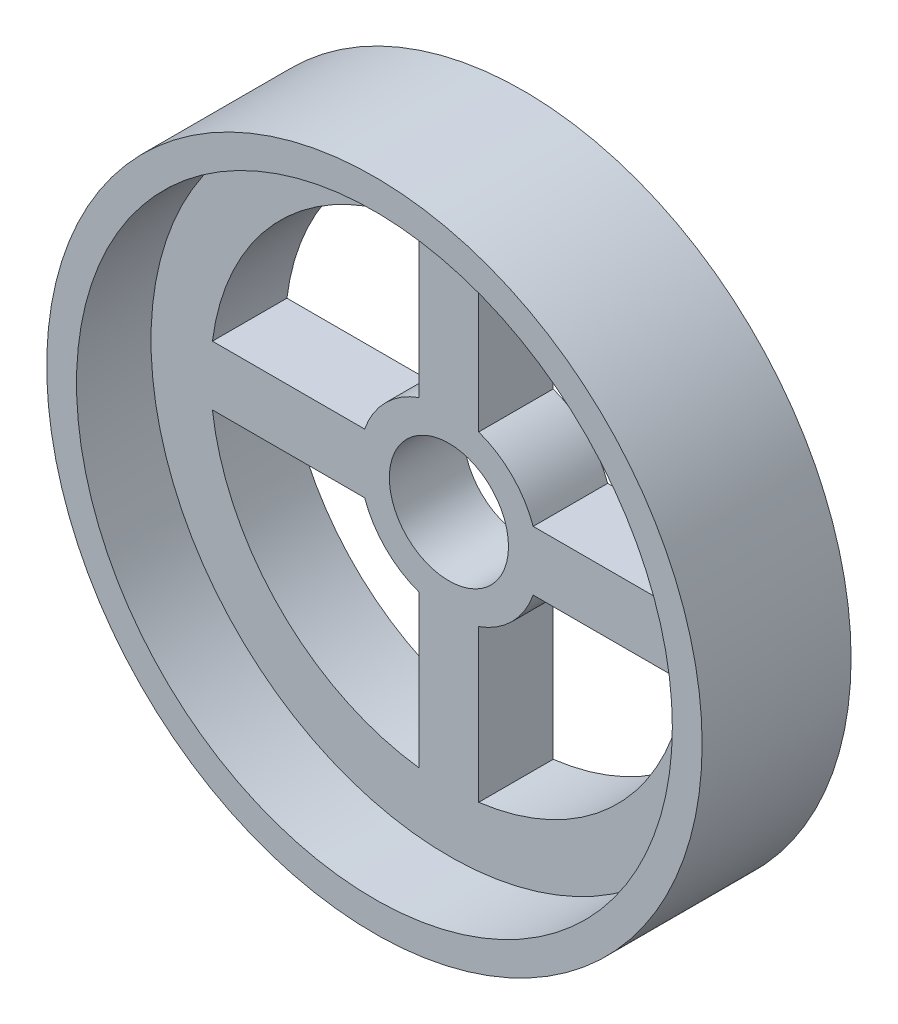
ISO-10303-21;
HEADER;
FILE_DESCRIPTION(('STEP AP214'),'2;1');
FILE_NAME('part.step','',(''),(''),'','','');
FILE_SCHEMA(('AUTOMOTIVE_DESIGN { 1 0 10303 214 1 1 1 1 }'));
ENDSEC;
DATA;
#1=APPLICATION_CONTEXT('core data for automotive mechanical design processes');
#2=APPLICATION_PROTOCOL_DEFINITION('international standard','automotive_design',2000,#1);
#3=PRODUCT_CONTEXT('',#1,'mechanical');
#4=PRODUCT('Part','Part','',(#3));
#5=PRODUCT_RELATED_PRODUCT_CATEGORY('part','',(#4));
#6=PRODUCT_DEFINITION_FORMATION('','',#4);
#7=PRODUCT_DEFINITION_CONTEXT('part definition',#1,'design');
#8=PRODUCT_DEFINITION('design','',#6,#7);
#9=PRODUCT_DEFINITION_SHAPE('','',#8);
#10=(LENGTH_UNIT() NAMED_UNIT(*) SI_UNIT(.MILLI.,.METRE.));
#11=(NAMED_UNIT(*) PLANE_ANGLE_UNIT() SI_UNIT($,.RADIAN.));
#12=(NAMED_UNIT(*) SI_UNIT($,.STERADIAN.) SOLID_ANGLE_UNIT());
#13=UNCERTAINTY_MEASURE_WITH_UNIT(LENGTH_MEASURE(1.E-05),#10,'distance_accuracy_value','');
#14=(GEOMETRIC_REPRESENTATION_CONTEXT(3) GLOBAL_UNCERTAINTY_ASSIGNED_CONTEXT((#13)) GLOBAL_UNIT_ASSIGNED_CONTEXT((#10,
#11,#12)) REPRESENTATION_CONTEXT('',''));
#15=CARTESIAN_POINT('',(0.,0.,0.));
#16=DIRECTION('',(0.,0.,1.));
#17=DIRECTION('',(1.,0.,0.));
#18=AXIS2_PLACEMENT_3D('',#15,#16,#17);
#19=CARTESIAN_POINT('',(0.,0.,-55.));
#20=DIRECTION('',(0.,0.,1.));
#21=DIRECTION('',(1.,0.,0.));
#22=AXIS2_PLACEMENT_3D('',#19,#20,#21);
#23=CYLINDRICAL_SURFACE('',#22,16.);
#24=DIRECTION('',(0.,0.,-1.));
#25=VECTOR('',#24,1.);
#26=CARTESIAN_POINT('',(2.,-15.8745078663875,5.));
#27=LINE('',#26,#25);
#28=CARTESIAN_POINT('',(2.,-15.8745078663875,5.));
#29=VERTEX_POINT('',#28);
#30=CARTESIAN_POINT('',(2.,-15.8745078663875,0.));
#31=VERTEX_POINT('',#30);
#32=EDGE_CURVE('E175',#29,#31,#27,.T.);
#33=ORIENTED_EDGE('',*,*,#32,.F.);
#34=CARTESIAN_POINT('',(0.,0.,5.));
#35=DIRECTION('',(0.,0.,1.));
#36=DIRECTION('',(1.,0.,0.));
#37=AXIS2_PLACEMENT_3D('',#34,#35,#36);
#38=CIRCLE('',#37,16.);
#39=CARTESIAN_POINT('',(15.8748460949581,-1.99731356111014,5.));
#40=VERTEX_POINT('',#39);
#41=EDGE_CURVE('E162',#29,#40,#38,.T.);
#42=ORIENTED_EDGE('',*,*,#41,.T.);
#43=DIRECTION('',(0.,0.,-1.));
#44=VECTOR('',#43,1.);
#45=CARTESIAN_POINT('',(15.8748460949581,-1.99731356111014,5.));
#46=LINE('',#45,#44);
#47=CARTESIAN_POINT('',(15.8748460949581,-1.99731356111014,0.));
#48=VERTEX_POINT('',#47);
#49=EDGE_CURVE('E58',#40,#48,#46,.T.);
#50=ORIENTED_EDGE('',*,*,#49,.T.);
#51=CARTESIAN_POINT('',(0.,0.,0.));
#52=DIRECTION('',(0.,0.,1.));
#53=DIRECTION('',(1.,0.,0.));
#54=AXIS2_PLACEMENT_3D('',#51,#52,#53);
#55=CIRCLE('',#54,16.);
#56=EDGE_CURVE('E62',#31,#48,#55,.T.);
#57=ORIENTED_EDGE('',*,*,#56,.F.);
#58=EDGE_LOOP('',(#33,#42,#50,#57));
#59=FACE_BOUND('',#58,.T.);
#60=ADVANCED_FACE('F41',(#59),#23,.F.);
#61=DIRECTION('',(0.,0.,-1.));
#62=VECTOR('',#61,1.);
#63=CARTESIAN_POINT('',(15.8748460949581,1.99731356111014,5.));
#64=LINE('',#63,#62);
#65=CARTESIAN_POINT('',(15.8748460949581,1.99731356111014,5.));
#66=VERTEX_POINT('',#65);
#67=CARTESIAN_POINT('',(15.8748460949581,1.99731356111014,0.));
#68=VERTEX_POINT('',#67);
#69=EDGE_CURVE('E298',#66,#68,#64,.T.);
#70=ORIENTED_EDGE('',*,*,#69,.F.);
#71=CARTESIAN_POINT('',(2.,15.8745078663875,5.));
#72=VERTEX_POINT('',#71);
#73=EDGE_CURVE('E308',#66,#72,#38,.T.);
#74=ORIENTED_EDGE('',*,*,#73,.T.);
#75=DIRECTION('',(0.,0.,-1.));
#76=VECTOR('',#75,1.);
#77=CARTESIAN_POINT('',(2.,15.8745078663875,5.));
#78=LINE('',#77,#76);
#79=CARTESIAN_POINT('',(2.,15.8745078663875,0.));
#80=VERTEX_POINT('',#79);
#81=EDGE_CURVE('E287',#72,#80,#78,.T.);
#82=ORIENTED_EDGE('',*,*,#81,.T.);
#83=EDGE_CURVE('E45',#68,#80,#55,.T.);
#84=ORIENTED_EDGE('',*,*,#83,.F.);
#85=EDGE_LOOP('',(#70,#74,#82,#84));
#86=FACE_BOUND('',#85,.T.);
#87=ADVANCED_FACE('F376',(#86),#23,.F.);
#88=DIRECTION('',(0.,0.,-1.));
#89=VECTOR('',#88,1.);
#90=CARTESIAN_POINT('',(-2.,15.8745078663875,5.));
#91=LINE('',#90,#89);
#92=CARTESIAN_POINT('',(-2.,15.8745078663875,5.));
#93=VERTEX_POINT('',#92);
#94=CARTESIAN_POINT('',(-2.,15.8745078663875,0.));
#95=VERTEX_POINT('',#94);
#96=EDGE_CURVE('E283',#93,#95,#91,.T.);
#97=ORIENTED_EDGE('',*,*,#96,.F.);
#98=CARTESIAN_POINT('',(-15.8748460949581,1.99731356111014,5.));
#99=VERTEX_POINT('',#98);
#100=EDGE_CURVE('E311',#93,#99,#38,.T.);
#101=ORIENTED_EDGE('',*,*,#100,.T.);
#102=DIRECTION('',(0.,0.,-1.));
#103=VECTOR('',#102,1.);
#104=CARTESIAN_POINT('',(-15.8748460949581,1.99731356111014,5.));
#105=LINE('',#104,#103);
#106=CARTESIAN_POINT('',(-15.8748460949581,1.99731356111014,0.));
#107=VERTEX_POINT('',#106);
#108=EDGE_CURVE('E272',#99,#107,#105,.T.);
#109=ORIENTED_EDGE('',*,*,#108,.T.);
#110=EDGE_CURVE('E326',#95,#107,#55,.T.);
#111=ORIENTED_EDGE('',*,*,#110,.F.);
#112=EDGE_LOOP('',(#97,#101,#109,#111));
#113=FACE_BOUND('',#112,.T.);
#114=ADVANCED_FACE('F382',(#113),#23,.F.);
#115=DIRECTION('',(0.,0.,-1.));
#116=VECTOR('',#115,1.);
#117=CARTESIAN_POINT('',(-15.8748460949581,-1.99731356111014,5.));
#118=LINE('',#117,#116);
#119=CARTESIAN_POINT('',(-15.8748460949581,-1.99731356111014,5.));
#120=VERTEX_POINT('',#119);
#121=CARTESIAN_POINT('',(-15.8748460949581,-1.99731356111014,0.));
#122=VERTEX_POINT('',#121);
#123=EDGE_CURVE('E268',#120,#122,#118,.T.);
#124=ORIENTED_EDGE('',*,*,#123,.F.);
#125=CARTESIAN_POINT('',(-2.,-15.8745078663875,5.));
#126=VERTEX_POINT('',#125);
#127=EDGE_CURVE('E358',#120,#126,#38,.T.);
#128=ORIENTED_EDGE('',*,*,#127,.T.);
#129=DIRECTION('',(0.,0.,-1.));
#130=VECTOR('',#129,1.);
#131=CARTESIAN_POINT('',(-2.,-15.8745078663875,5.));
#132=LINE('',#131,#130);
#133=CARTESIAN_POINT('',(-2.,-15.8745078663875,0.));
#134=VERTEX_POINT('',#133);
#135=EDGE_CURVE('E218',#126,#134,#132,.T.);
#136=ORIENTED_EDGE('',*,*,#135,.T.);
#137=EDGE_CURVE('E332',#122,#134,#55,.T.);
#138=ORIENTED_EDGE('',*,*,#137,.F.);
#139=EDGE_LOOP('',(#124,#128,#136,#138));
#140=FACE_BOUND('',#139,.T.);
#141=ADVANCED_FACE('F357',(#140),#23,.F.);
#142=CARTESIAN_POINT('',(0.,0.,5.));
#143=DIRECTION('',(0.,0.,1.));
#144=DIRECTION('',(1.,0.,0.));
#145=AXIS2_PLACEMENT_3D('',#142,#143,#144);
#146=PLANE('',#145);
#147=ORIENTED_EDGE('',*,*,#41,.F.);
#148=DIRECTION('',(0.,1.,0.));
#149=VECTOR('',#148,1.);
#150=CARTESIAN_POINT('',(2.,-15.8745078663875,5.));
#151=LINE('',#150,#149);
#152=CARTESIAN_POINT('',(2.,-5.65685424949238,5.));
#153=VERTEX_POINT('',#152);
#154=EDGE_CURVE('E154',#29,#153,#151,.T.);
#155=ORIENTED_EDGE('',*,*,#154,.T.);
#156=CARTESIAN_POINT('',(0.,0.,5.));
#157=DIRECTION('',(0.,0.,1.));
#158=DIRECTION('',(1.,0.,0.));
#159=AXIS2_PLACEMENT_3D('',#156,#157,#158);
#160=CIRCLE('',#159,6.);
#161=CARTESIAN_POINT('',(5.65780333155948,-1.99731356111014,5.));
#162=VERTEX_POINT('',#161);
#163=EDGE_CURVE('E160',#153,#162,#160,.T.);
#164=ORIENTED_EDGE('',*,*,#163,.T.);
#165=DIRECTION('',(1.,0.,0.));
#166=VECTOR('',#165,1.);
#167=CARTESIAN_POINT('',(15.8748460949581,-1.99731356111014,5.));
#168=LINE('',#167,#166);
#169=EDGE_CURVE('E182',#162,#40,#168,.T.);
#170=ORIENTED_EDGE('',*,*,#169,.T.);
#171=EDGE_LOOP('',(#147,#155,#164,#170));
#172=FACE_BOUND('',#171,.T.);
#173=ORIENTED_EDGE('',*,*,#127,.F.);
#174=DIRECTION('',(1.,0.,0.));
#175=VECTOR('',#174,1.);
#176=CARTESIAN_POINT('',(-5.65780333155948,-1.99731356111014,5.));
#177=LINE('',#176,#175);
#178=CARTESIAN_POINT('',(-5.65780333155948,-1.99731356111014,5.));
#179=VERTEX_POINT('',#178);
#180=EDGE_CURVE('E208',#120,#179,#177,.T.);
#181=ORIENTED_EDGE('',*,*,#180,.T.);
#182=CARTESIAN_POINT('',(0.,0.,5.));
#183=DIRECTION('',(0.,0.,1.));
#184=DIRECTION('',(1.,0.,0.));
#185=AXIS2_PLACEMENT_3D('',#182,#183,#184);
#186=CIRCLE('',#185,6.);
#187=CARTESIAN_POINT('',(-2.,-5.65685424949238,5.));
#188=VERTEX_POINT('',#187);
#189=EDGE_CURVE('E211',#179,#188,#186,.T.);
#190=ORIENTED_EDGE('',*,*,#189,.T.);
#191=DIRECTION('',(0.,-1.,0.));
#192=VECTOR('',#191,1.);
#193=CARTESIAN_POINT('',(-2.,-15.8745078663875,5.));
#194=LINE('',#193,#192);
#195=EDGE_CURVE('E214',#188,#126,#194,.T.);
#196=ORIENTED_EDGE('',*,*,#195,.T.);
#197=EDGE_LOOP('',(#173,#181,#190,#196));
#198=FACE_BOUND('',#197,.T.);
#199=ORIENTED_EDGE('',*,*,#100,.F.);
#200=DIRECTION('',(0.,-1.,0.));
#201=VECTOR('',#200,1.);
#202=CARTESIAN_POINT('',(-2.,5.65685424949238,5.));
#203=LINE('',#202,#201);
#204=CARTESIAN_POINT('',(-2.,5.65685424949238,5.));
#205=VERTEX_POINT('',#204);
#206=EDGE_CURVE('E198',#93,#205,#203,.T.);
#207=ORIENTED_EDGE('',*,*,#206,.T.);
#208=CARTESIAN_POINT('',(0.,0.,5.));
#209=DIRECTION('',(0.,0.,1.));
#210=DIRECTION('',(1.,0.,0.));
#211=AXIS2_PLACEMENT_3D('',#208,#209,#210);
#212=CIRCLE('',#211,6.);
#213=CARTESIAN_POINT('',(-5.65780333155948,1.99731356111014,5.));
#214=VERTEX_POINT('',#213);
#215=EDGE_CURVE('E201',#205,#214,#212,.T.);
#216=ORIENTED_EDGE('',*,*,#215,.T.);
#217=DIRECTION('',(-1.,0.,0.));
#218=VECTOR('',#217,1.);
#219=CARTESIAN_POINT('',(-5.65780333155948,1.99731356111014,5.));
#220=LINE('',#219,#218);
#221=EDGE_CURVE('E204',#214,#99,#220,.T.);
#222=ORIENTED_EDGE('',*,*,#221,.T.);
#223=EDGE_LOOP('',(#199,#207,#216,#222));
#224=FACE_BOUND('',#223,.T.);
#225=ORIENTED_EDGE('',*,*,#73,.F.);
#226=DIRECTION('',(-1.,0.,0.));
#227=VECTOR('',#226,1.);
#228=CARTESIAN_POINT('',(15.8748460949581,1.99731356111014,5.));
#229=LINE('',#228,#227);
#230=CARTESIAN_POINT('',(5.65780333155948,1.99731356111014,5.));
#231=VERTEX_POINT('',#230);
#232=EDGE_CURVE('E185',#66,#231,#229,.T.);
#233=ORIENTED_EDGE('',*,*,#232,.T.);
#234=CARTESIAN_POINT('',(0.,0.,5.));
#235=DIRECTION('',(0.,0.,1.));
#236=DIRECTION('',(1.,0.,0.));
#237=AXIS2_PLACEMENT_3D('',#234,#235,#236);
#238=CIRCLE('',#237,6.);
#239=CARTESIAN_POINT('',(2.,5.65685424949238,5.));
#240=VERTEX_POINT('',#239);
#241=EDGE_CURVE('E191',#231,#240,#238,.T.);
#242=ORIENTED_EDGE('',*,*,#241,.T.);
#243=DIRECTION('',(0.,1.,0.));
#244=VECTOR('',#243,1.);
#245=CARTESIAN_POINT('',(2.,5.65685424949238,5.));
#246=LINE('',#245,#244);
#247=EDGE_CURVE('E194',#240,#72,#246,.T.);
#248=ORIENTED_EDGE('',*,*,#247,.T.);
#249=EDGE_LOOP('',(#225,#233,#242,#248));
#250=FACE_BOUND('',#249,.T.);
#251=CARTESIAN_POINT('',(0.,0.,5.));
#252=DIRECTION('',(0.,0.,1.));
#253=DIRECTION('',(1.,0.,0.));
#254=AXIS2_PLACEMENT_3D('',#251,#252,#253);
#255=CIRCLE('',#254,20.);
#256=CARTESIAN_POINT('',(20.,0.,5.));
#257=VERTEX_POINT('',#256);
#258=EDGE_CURVE('E11',#257,#257,#255,.F.);
#259=ORIENTED_EDGE('',*,*,#258,.F.);
#260=EDGE_LOOP('',(#259));
#261=FACE_BOUND('',#260,.T.);
#262=CARTESIAN_POINT('',(0.,0.,5.));
#263=DIRECTION('',(0.,0.,1.));
#264=DIRECTION('',(1.,0.,0.));
#265=AXIS2_PLACEMENT_3D('',#262,#263,#264);
#266=CIRCLE('',#265,4.);
#267=CARTESIAN_POINT('',(4.,0.,5.));
#268=VERTEX_POINT('',#267);
#269=EDGE_CURVE('E222',#268,#268,#266,.T.);
#270=ORIENTED_EDGE('',*,*,#269,.F.);
#271=EDGE_LOOP('',(#270));
#272=FACE_BOUND('',#271,.T.);
#273=ADVANCED_FACE('F156',(#172,#198,#224,#250,#261,#272),#146,.T.);
#274=CARTESIAN_POINT('',(0.,0.,0.));
#275=DIRECTION('',(0.,0.,1.));
#276=DIRECTION('',(1.,0.,0.));
#277=AXIS2_PLACEMENT_3D('',#274,#275,#276);
#278=PLANE('',#277);
#279=DIRECTION('',(0.,1.,0.));
#280=VECTOR('',#279,1.);
#281=CARTESIAN_POINT('',(2.,-15.8745078663875,0.));
#282=LINE('',#281,#280);
#283=CARTESIAN_POINT('',(2.,-5.65685424949238,0.));
#284=VERTEX_POINT('',#283);
#285=EDGE_CURVE('E171',#31,#284,#282,.T.);
#286=ORIENTED_EDGE('',*,*,#285,.F.);
#287=ORIENTED_EDGE('',*,*,#56,.T.);
#288=DIRECTION('',(1.,0.,0.));
#289=VECTOR('',#288,1.);
#290=CARTESIAN_POINT('',(15.8748460949581,-1.99731356111014,0.));
#291=LINE('',#290,#289);
#292=CARTESIAN_POINT('',(5.65780333155948,-1.99731356111014,0.));
#293=VERTEX_POINT('',#292);
#294=EDGE_CURVE('E225',#293,#48,#291,.T.);
#295=ORIENTED_EDGE('',*,*,#294,.F.);
#296=CARTESIAN_POINT('',(0.,0.,0.));
#297=DIRECTION('',(0.,0.,1.));
#298=DIRECTION('',(1.,0.,0.));
#299=AXIS2_PLACEMENT_3D('',#296,#297,#298);
#300=CIRCLE('',#299,6.);
#301=EDGE_CURVE('E221',#284,#293,#300,.T.);
#302=ORIENTED_EDGE('',*,*,#301,.F.);
#303=EDGE_LOOP('',(#286,#287,#295,#302));
#304=FACE_BOUND('',#303,.T.);
#305=DIRECTION('',(1.,0.,0.));
#306=VECTOR('',#305,1.);
#307=CARTESIAN_POINT('',(-5.65780333155948,-1.99731356111014,0.));
#308=LINE('',#307,#306);
#309=CARTESIAN_POINT('',(-5.65780333155948,-1.99731356111014,0.));
#310=VERTEX_POINT('',#309);
#311=EDGE_CURVE('E249',#122,#310,#308,.T.);
#312=ORIENTED_EDGE('',*,*,#311,.F.);
#313=ORIENTED_EDGE('',*,*,#137,.T.);
#314=DIRECTION('',(0.,-1.,0.));
#315=VECTOR('',#314,1.);
#316=CARTESIAN_POINT('',(-2.,-15.8745078663875,0.));
#317=LINE('',#316,#315);
#318=CARTESIAN_POINT('',(-2.,-5.65685424949238,0.));
#319=VERTEX_POINT('',#318);
#320=EDGE_CURVE('E166',#319,#134,#317,.T.);
#321=ORIENTED_EDGE('',*,*,#320,.F.);
#322=CARTESIAN_POINT('',(0.,0.,0.));
#323=DIRECTION('',(0.,0.,1.));
#324=DIRECTION('',(1.,0.,0.));
#325=AXIS2_PLACEMENT_3D('',#322,#323,#324);
#326=CIRCLE('',#325,6.);
#327=EDGE_CURVE('E252',#310,#319,#326,.T.);
#328=ORIENTED_EDGE('',*,*,#327,.F.);
#329=EDGE_LOOP('',(#312,#313,#321,#328));
#330=FACE_BOUND('',#329,.T.);
#331=DIRECTION('',(0.,-1.,0.));
#332=VECTOR('',#331,1.);
#333=CARTESIAN_POINT('',(-2.,5.65685424949238,0.));
#334=LINE('',#333,#332);
#335=CARTESIAN_POINT('',(-2.,5.65685424949238,0.));
#336=VERTEX_POINT('',#335);
#337=EDGE_CURVE('E239',#95,#336,#334,.T.);
#338=ORIENTED_EDGE('',*,*,#337,.F.);
#339=ORIENTED_EDGE('',*,*,#110,.T.);
#340=DIRECTION('',(-1.,0.,0.));
#341=VECTOR('',#340,1.);
#342=CARTESIAN_POINT('',(-5.65780333155948,1.99731356111014,0.));
#343=LINE('',#342,#341);
#344=CARTESIAN_POINT('',(-5.65780333155948,1.99731356111014,0.));
#345=VERTEX_POINT('',#344);
#346=EDGE_CURVE('E245',#345,#107,#343,.T.);
#347=ORIENTED_EDGE('',*,*,#346,.F.);
#348=CARTESIAN_POINT('',(0.,0.,0.));
#349=DIRECTION('',(0.,0.,1.));
#350=DIRECTION('',(1.,0.,0.));
#351=AXIS2_PLACEMENT_3D('',#348,#349,#350);
#352=CIRCLE('',#351,6.);
#353=EDGE_CURVE('E242',#336,#345,#352,.T.);
#354=ORIENTED_EDGE('',*,*,#353,.F.);
#355=EDGE_LOOP('',(#338,#339,#347,#354));
#356=FACE_BOUND('',#355,.T.);
#357=ORIENTED_EDGE('',*,*,#83,.T.);
#358=DIRECTION('',(0.,1.,0.));
#359=VECTOR('',#358,1.);
#360=CARTESIAN_POINT('',(2.,5.65685424949238,0.));
#361=LINE('',#360,#359);
#362=CARTESIAN_POINT('',(2.,5.65685424949238,0.));
#363=VERTEX_POINT('',#362);
#364=EDGE_CURVE('E235',#363,#80,#361,.T.);
#365=ORIENTED_EDGE('',*,*,#364,.F.);
#366=CARTESIAN_POINT('',(0.,0.,0.));
#367=DIRECTION('',(0.,0.,1.));
#368=DIRECTION('',(1.,0.,0.));
#369=AXIS2_PLACEMENT_3D('',#366,#367,#368);
#370=CIRCLE('',#369,6.);
#371=CARTESIAN_POINT('',(5.65780333155948,1.99731356111014,0.));
#372=VERTEX_POINT('',#371);
#373=EDGE_CURVE('E232',#372,#363,#370,.T.);
#374=ORIENTED_EDGE('',*,*,#373,.F.);
#375=DIRECTION('',(-1.,0.,0.));
#376=VECTOR('',#375,1.);
#377=CARTESIAN_POINT('',(15.8748460949581,1.99731356111014,0.));
#378=LINE('',#377,#376);
#379=EDGE_CURVE('E229',#68,#372,#378,.T.);
#380=ORIENTED_EDGE('',*,*,#379,.F.);
#381=EDGE_LOOP('',(#357,#365,#374,#380));
#382=FACE_BOUND('',#381,.T.);
#383=CARTESIAN_POINT('',(0.,0.,0.));
#384=DIRECTION('',(0.,0.,1.));
#385=DIRECTION('',(1.,0.,0.));
#386=AXIS2_PLACEMENT_3D('',#383,#384,#385);
#387=CIRCLE('',#386,22.);
#388=CARTESIAN_POINT('',(22.,0.,0.));
#389=VERTEX_POINT('',#388);
#390=EDGE_CURVE('E316',#389,#389,#387,.T.);
#391=ORIENTED_EDGE('',*,*,#390,.F.);
#392=EDGE_LOOP('',(#391));
#393=FACE_BOUND('',#392,.T.);
#394=CARTESIAN_POINT('',(0.,0.,0.));
#395=DIRECTION('',(0.,0.,1.));
#396=DIRECTION('',(1.,0.,0.));
#397=AXIS2_PLACEMENT_3D('',#394,#395,#396);
#398=CIRCLE('',#397,4.);
#399=CARTESIAN_POINT('',(4.,0.,0.));
#400=VERTEX_POINT('',#399);
#401=EDGE_CURVE('E415',#400,#400,#398,.T.);
#402=ORIENTED_EDGE('',*,*,#401,.T.);
#403=EDGE_LOOP('',(#402));
#404=FACE_BOUND('',#403,.T.);
#405=ADVANCED_FACE('F43',(#304,#330,#356,#382,#393,#404),#278,.F.);
#406=CARTESIAN_POINT('',(0.,0.,10.));
#407=DIRECTION('',(0.,0.,-1.));
#408=DIRECTION('',(-1.,0.,0.));
#409=AXIS2_PLACEMENT_3D('',#406,#407,#408);
#410=CYLINDRICAL_SURFACE('',#409,20.);
#411=ORIENTED_EDGE('',*,*,#258,.T.);
#412=EDGE_LOOP('',(#411));
#413=FACE_BOUND('',#412,.T.);
#414=CARTESIAN_POINT('',(0.,0.,10.));
#415=DIRECTION('',(0.,0.,1.));
#416=DIRECTION('',(1.,0.,0.));
#417=AXIS2_PLACEMENT_3D('',#414,#415,#416);
#418=CIRCLE('',#417,20.);
#419=CARTESIAN_POINT('',(20.,0.,10.));
#420=VERTEX_POINT('',#419);
#421=EDGE_CURVE('E312',#420,#420,#418,.T.);
#422=ORIENTED_EDGE('',*,*,#421,.T.);
#423=EDGE_LOOP('',(#422));
#424=FACE_BOUND('',#423,.T.);
#425=ADVANCED_FACE('F366',(#413,#424),#410,.F.);
#426=CARTESIAN_POINT('',(0.,0.,10.));
#427=DIRECTION('',(0.,0.,-1.));
#428=DIRECTION('',(-1.,0.,0.));
#429=AXIS2_PLACEMENT_3D('',#426,#427,#428);
#430=CYLINDRICAL_SURFACE('',#429,22.);
#431=CARTESIAN_POINT('',(0.,0.,10.));
#432=DIRECTION('',(0.,0.,1.));
#433=DIRECTION('',(1.,0.,0.));
#434=AXIS2_PLACEMENT_3D('',#431,#432,#433);
#435=CIRCLE('',#434,22.);
#436=CARTESIAN_POINT('',(22.,0.,10.));
#437=VERTEX_POINT('',#436);
#438=EDGE_CURVE('E51',#437,#437,#435,.T.);
#439=ORIENTED_EDGE('',*,*,#438,.F.);
#440=EDGE_LOOP('',(#439));
#441=FACE_BOUND('',#440,.T.);
#442=ORIENTED_EDGE('',*,*,#390,.T.);
#443=EDGE_LOOP('',(#442));
#444=FACE_BOUND('',#443,.T.);
#445=ADVANCED_FACE('F372',(#441,#444),#430,.T.);
#446=CARTESIAN_POINT('',(0.,0.,10.));
#447=DIRECTION('',(0.,0.,1.));
#448=DIRECTION('',(1.,0.,0.));
#449=AXIS2_PLACEMENT_3D('',#446,#447,#448);
#450=PLANE('',#449);
#451=ORIENTED_EDGE('',*,*,#421,.F.);
#452=EDGE_LOOP('',(#451));
#453=FACE_BOUND('',#452,.T.);
#454=ORIENTED_EDGE('',*,*,#438,.T.);
#455=EDGE_LOOP('',(#454));
#456=FACE_BOUND('',#455,.T.);
#457=ADVANCED_FACE('F457',(#453,#456),#450,.T.);
#458=CARTESIAN_POINT('',(2.,-15.8745078663875,5.));
#459=DIRECTION('',(-1.,0.,0.));
#460=DIRECTION('',(0.,0.,1.));
#461=AXIS2_PLACEMENT_3D('',#458,#459,#460);
#462=PLANE('',#461);
#463=ORIENTED_EDGE('',*,*,#285,.T.);
#464=DIRECTION('',(0.,0.,-1.));
#465=VECTOR('',#464,1.);
#466=CARTESIAN_POINT('',(2.,-5.65685424949238,5.));
#467=LINE('',#466,#465);
#468=EDGE_CURVE('E169',#153,#284,#467,.T.);
#469=ORIENTED_EDGE('',*,*,#468,.F.);
#470=ORIENTED_EDGE('',*,*,#154,.F.);
#471=ORIENTED_EDGE('',*,*,#32,.T.);
#472=EDGE_LOOP('',(#463,#469,#470,#471));
#473=FACE_BOUND('',#472,.T.);
#474=ADVANCED_FACE('F170',(#473),#462,.F.);
#475=CARTESIAN_POINT('',(0.,0.,5.));
#476=DIRECTION('',(0.,0.,-1.));
#477=DIRECTION('',(-1.,0.,0.));
#478=AXIS2_PLACEMENT_3D('',#475,#476,#477);
#479=CYLINDRICAL_SURFACE('',#478,6.);
#480=ORIENTED_EDGE('',*,*,#301,.T.);
#481=DIRECTION('',(0.,0.,-1.));
#482=VECTOR('',#481,1.);
#483=CARTESIAN_POINT('',(5.65780333155948,-1.99731356111014,5.));
#484=LINE('',#483,#482);
#485=EDGE_CURVE('E176',#162,#293,#484,.T.);
#486=ORIENTED_EDGE('',*,*,#485,.F.);
#487=ORIENTED_EDGE('',*,*,#163,.F.);
#488=ORIENTED_EDGE('',*,*,#468,.T.);
#489=EDGE_LOOP('',(#480,#486,#487,#488));
#490=FACE_BOUND('',#489,.T.);
#491=ADVANCED_FACE('F178',(#490),#479,.T.);
#492=CARTESIAN_POINT('',(15.8748460949581,-1.99731356111014,5.));
#493=DIRECTION('',(0.,1.,0.));
#494=DIRECTION('',(0.,0.,1.));
#495=AXIS2_PLACEMENT_3D('',#492,#493,#494);
#496=PLANE('',#495);
#497=ORIENTED_EDGE('',*,*,#294,.T.);
#498=ORIENTED_EDGE('',*,*,#49,.F.);
#499=ORIENTED_EDGE('',*,*,#169,.F.);
#500=ORIENTED_EDGE('',*,*,#485,.T.);
#501=EDGE_LOOP('',(#497,#498,#499,#500));
#502=FACE_BOUND('',#501,.T.);
#503=ADVANCED_FACE('F364',(#502),#496,.F.);
#504=CARTESIAN_POINT('',(15.8748460949581,1.99731356111014,5.));
#505=DIRECTION('',(0.,-1.,0.));
#506=DIRECTION('',(0.,0.,-1.));
#507=AXIS2_PLACEMENT_3D('',#504,#505,#506);
#508=PLANE('',#507);
#509=ORIENTED_EDGE('',*,*,#379,.T.);
#510=DIRECTION('',(0.,0.,-1.));
#511=VECTOR('',#510,1.);
#512=CARTESIAN_POINT('',(5.65780333155948,1.99731356111014,5.));
#513=LINE('',#512,#511);
#514=EDGE_CURVE('E294',#231,#372,#513,.T.);
#515=ORIENTED_EDGE('',*,*,#514,.F.);
#516=ORIENTED_EDGE('',*,*,#232,.F.);
#517=ORIENTED_EDGE('',*,*,#69,.T.);
#518=EDGE_LOOP('',(#509,#515,#516,#517));
#519=FACE_BOUND('',#518,.T.);
#520=ADVANCED_FACE('F449',(#519),#508,.F.);
#521=CARTESIAN_POINT('',(0.,0.,5.));
#522=DIRECTION('',(0.,0.,-1.));
#523=DIRECTION('',(-1.,0.,0.));
#524=AXIS2_PLACEMENT_3D('',#521,#522,#523);
#525=CYLINDRICAL_SURFACE('',#524,6.);
#526=ORIENTED_EDGE('',*,*,#373,.T.);
#527=DIRECTION('',(0.,0.,-1.));
#528=VECTOR('',#527,1.);
#529=CARTESIAN_POINT('',(2.,5.65685424949238,5.));
#530=LINE('',#529,#528);
#531=EDGE_CURVE('E290',#240,#363,#530,.T.);
#532=ORIENTED_EDGE('',*,*,#531,.F.);
#533=ORIENTED_EDGE('',*,*,#241,.F.);
#534=ORIENTED_EDGE('',*,*,#514,.T.);
#535=EDGE_LOOP('',(#526,#532,#533,#534));
#536=FACE_BOUND('',#535,.T.);
#537=ADVANCED_FACE('F445',(#536),#525,.T.);
#538=CARTESIAN_POINT('',(2.,5.65685424949238,5.));
#539=DIRECTION('',(-1.,0.,0.));
#540=DIRECTION('',(0.,-1.,0.));
#541=AXIS2_PLACEMENT_3D('',#538,#539,#540);
#542=PLANE('',#541);
#543=ORIENTED_EDGE('',*,*,#364,.T.);
#544=ORIENTED_EDGE('',*,*,#81,.F.);
#545=ORIENTED_EDGE('',*,*,#247,.F.);
#546=ORIENTED_EDGE('',*,*,#531,.T.);
#547=EDGE_LOOP('',(#543,#544,#545,#546));
#548=FACE_BOUND('',#547,.T.);
#549=ADVANCED_FACE('F442',(#548),#542,.F.);
#550=CARTESIAN_POINT('',(-2.,5.65685424949238,5.));
#551=DIRECTION('',(1.,0.,0.));
#552=DIRECTION('',(0.,1.,0.));
#553=AXIS2_PLACEMENT_3D('',#550,#551,#552);
#554=PLANE('',#553);
#555=ORIENTED_EDGE('',*,*,#337,.T.);
#556=DIRECTION('',(0.,0.,-1.));
#557=VECTOR('',#556,1.);
#558=CARTESIAN_POINT('',(-2.,5.65685424949238,5.));
#559=LINE('',#558,#557);
#560=EDGE_CURVE('E279',#205,#336,#559,.T.);
#561=ORIENTED_EDGE('',*,*,#560,.F.);
#562=ORIENTED_EDGE('',*,*,#206,.F.);
#563=ORIENTED_EDGE('',*,*,#96,.T.);
#564=EDGE_LOOP('',(#555,#561,#562,#563));
#565=FACE_BOUND('',#564,.T.);
#566=ADVANCED_FACE('F402',(#565),#554,.F.);
#567=CARTESIAN_POINT('',(0.,0.,5.));
#568=DIRECTION('',(0.,0.,-1.));
#569=DIRECTION('',(-1.,0.,0.));
#570=AXIS2_PLACEMENT_3D('',#567,#568,#569);
#571=CYLINDRICAL_SURFACE('',#570,6.);
#572=ORIENTED_EDGE('',*,*,#353,.T.);
#573=DIRECTION('',(0.,0.,-1.));
#574=VECTOR('',#573,1.);
#575=CARTESIAN_POINT('',(-5.65780333155948,1.99731356111014,5.));
#576=LINE('',#575,#574);
#577=EDGE_CURVE('E275',#214,#345,#576,.T.);
#578=ORIENTED_EDGE('',*,*,#577,.F.);
#579=ORIENTED_EDGE('',*,*,#215,.F.);
#580=ORIENTED_EDGE('',*,*,#560,.T.);
#581=EDGE_LOOP('',(#572,#578,#579,#580));
#582=FACE_BOUND('',#581,.T.);
#583=ADVANCED_FACE('F407',(#582),#571,.T.);
#584=CARTESIAN_POINT('',(-5.65780333155948,1.99731356111014,5.));
#585=DIRECTION('',(0.,-1.,0.));
#586=DIRECTION('',(0.,0.,-1.));
#587=AXIS2_PLACEMENT_3D('',#584,#585,#586);
#588=PLANE('',#587);
#589=ORIENTED_EDGE('',*,*,#346,.T.);
#590=ORIENTED_EDGE('',*,*,#108,.F.);
#591=ORIENTED_EDGE('',*,*,#221,.F.);
#592=ORIENTED_EDGE('',*,*,#577,.T.);
#593=EDGE_LOOP('',(#589,#590,#591,#592));
#594=FACE_BOUND('',#593,.T.);
#595=ADVANCED_FACE('F410',(#594),#588,.F.);
#596=CARTESIAN_POINT('',(-5.65780333155948,-1.99731356111014,5.));
#597=DIRECTION('',(0.,1.,0.));
#598=DIRECTION('',(-1.,0.,0.));
#599=AXIS2_PLACEMENT_3D('',#596,#597,#598);
#600=PLANE('',#599);
#601=ORIENTED_EDGE('',*,*,#311,.T.);
#602=DIRECTION('',(0.,0.,-1.));
#603=VECTOR('',#602,1.);
#604=CARTESIAN_POINT('',(-5.65780333155948,-1.99731356111014,5.));
#605=LINE('',#604,#603);
#606=EDGE_CURVE('E264',#179,#310,#605,.T.);
#607=ORIENTED_EDGE('',*,*,#606,.F.);
#608=ORIENTED_EDGE('',*,*,#180,.F.);
#609=ORIENTED_EDGE('',*,*,#123,.T.);
#610=EDGE_LOOP('',(#601,#607,#608,#609));
#611=FACE_BOUND('',#610,.T.);
#612=ADVANCED_FACE('F355',(#611),#600,.F.);
#613=CARTESIAN_POINT('',(0.,0.,5.));
#614=DIRECTION('',(0.,0.,-1.));
#615=DIRECTION('',(-1.,0.,0.));
#616=AXIS2_PLACEMENT_3D('',#613,#614,#615);
#617=CYLINDRICAL_SURFACE('',#616,6.);
#618=ORIENTED_EDGE('',*,*,#327,.T.);
#619=DIRECTION('',(0.,0.,-1.));
#620=VECTOR('',#619,1.);
#621=CARTESIAN_POINT('',(-2.,-5.65685424949238,5.));
#622=LINE('',#621,#620);
#623=EDGE_CURVE('E260',#188,#319,#622,.T.);
#624=ORIENTED_EDGE('',*,*,#623,.F.);
#625=ORIENTED_EDGE('',*,*,#189,.F.);
#626=ORIENTED_EDGE('',*,*,#606,.T.);
#627=EDGE_LOOP('',(#618,#624,#625,#626));
#628=FACE_BOUND('',#627,.T.);
#629=ADVANCED_FACE('F351',(#628),#617,.T.);
#630=CARTESIAN_POINT('',(-2.,-15.8745078663875,5.));
#631=DIRECTION('',(1.,0.,0.));
#632=DIRECTION('',(0.,0.,-1.));
#633=AXIS2_PLACEMENT_3D('',#630,#631,#632);
#634=PLANE('',#633);
#635=ORIENTED_EDGE('',*,*,#320,.T.);
#636=ORIENTED_EDGE('',*,*,#135,.F.);
#637=ORIENTED_EDGE('',*,*,#195,.F.);
#638=ORIENTED_EDGE('',*,*,#623,.T.);
#639=EDGE_LOOP('',(#635,#636,#637,#638));
#640=FACE_BOUND('',#639,.T.);
#641=ADVANCED_FACE('F346',(#640),#634,.F.);
#642=CARTESIAN_POINT('',(0.,0.,5.));
#643=DIRECTION('',(0.,0.,-1.));
#644=DIRECTION('',(-1.,0.,0.));
#645=AXIS2_PLACEMENT_3D('',#642,#643,#644);
#646=CYLINDRICAL_SURFACE('',#645,4.);
#647=ORIENTED_EDGE('',*,*,#269,.T.);
#648=EDGE_LOOP('',(#647));
#649=FACE_BOUND('',#648,.T.);
#650=ORIENTED_EDGE('',*,*,#401,.F.);
#651=EDGE_LOOP('',(#650));
#652=FACE_BOUND('',#651,.T.);
#653=ADVANCED_FACE('F423',(#649,#652),#646,.F.);
#654=CLOSED_SHELL('',(#60,#87,#114,#141,#273,#405,#425,#445,#457,#474,#491,#503,#520,#537,#549,
#566,#583,#595,#612,#629,#641,#653));
#655=MANIFOLD_SOLID_BREP('B2',#654);
#656=ADVANCED_BREP_SHAPE_REPRESENTATION('',(#18,#655),#14);
#657=SHAPE_DEFINITION_REPRESENTATION(#9,#656);
ENDSEC;
END-ISO-10303-21;
